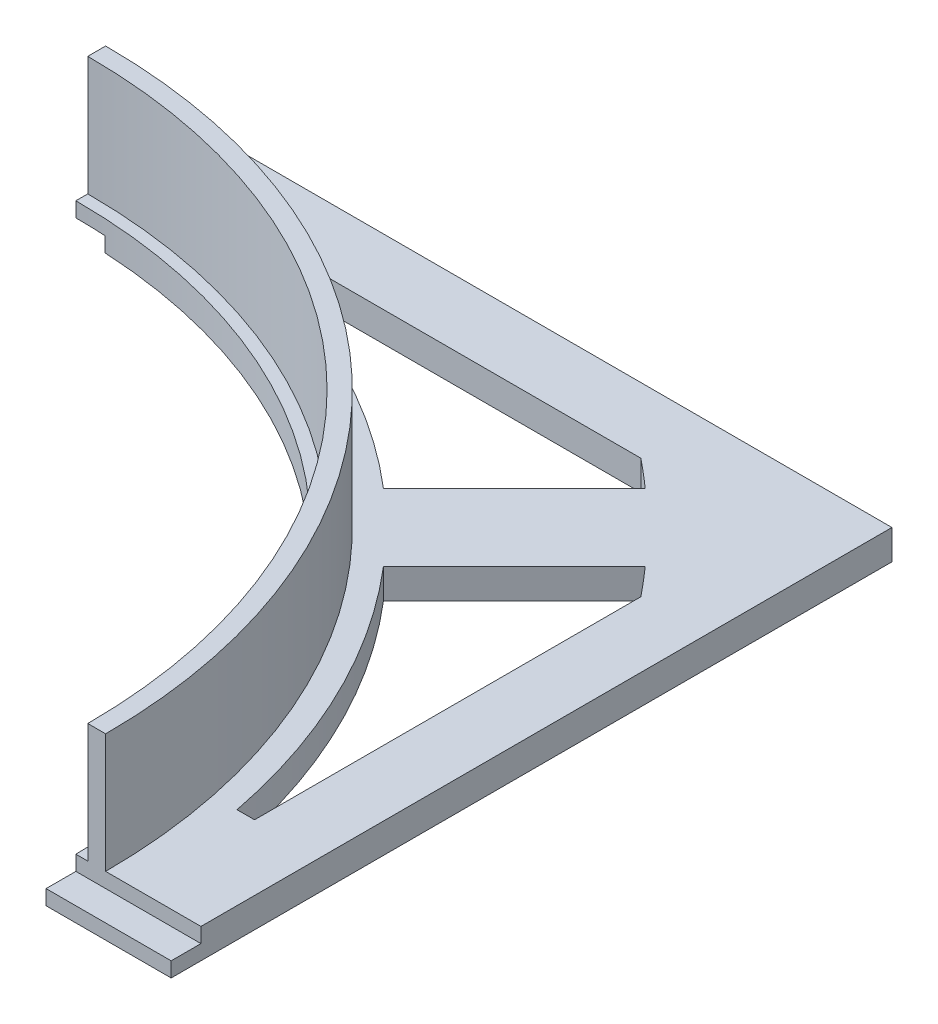
ISO-10303-21;
HEADER;
FILE_DESCRIPTION(('STEP AP214'),'2;1');
FILE_NAME('part.step','',(''),(''),'','','');
FILE_SCHEMA(('AUTOMOTIVE_DESIGN { 1 0 10303 214 1 1 1 1 }'));
ENDSEC;
DATA;
#1=APPLICATION_CONTEXT('core data for automotive mechanical design processes');
#2=APPLICATION_PROTOCOL_DEFINITION('international standard','automotive_design',2000,#1);
#3=PRODUCT_CONTEXT('',#1,'mechanical');
#4=PRODUCT('Part','Part','',(#3));
#5=PRODUCT_RELATED_PRODUCT_CATEGORY('part','',(#4));
#6=PRODUCT_DEFINITION_FORMATION('','',#4);
#7=PRODUCT_DEFINITION_CONTEXT('part definition',#1,'design');
#8=PRODUCT_DEFINITION('design','',#6,#7);
#9=PRODUCT_DEFINITION_SHAPE('','',#8);
#10=(LENGTH_UNIT() NAMED_UNIT(*) SI_UNIT(.MILLI.,.METRE.));
#11=(NAMED_UNIT(*) PLANE_ANGLE_UNIT() SI_UNIT($,.RADIAN.));
#12=(NAMED_UNIT(*) SI_UNIT($,.STERADIAN.) SOLID_ANGLE_UNIT());
#13=UNCERTAINTY_MEASURE_WITH_UNIT(LENGTH_MEASURE(1.E-05),#10,'distance_accuracy_value','');
#14=(GEOMETRIC_REPRESENTATION_CONTEXT(3) GLOBAL_UNCERTAINTY_ASSIGNED_CONTEXT((#13)) GLOBAL_UNIT_ASSIGNED_CONTEXT((#10,
#11,#12)) REPRESENTATION_CONTEXT('',''));
#15=CARTESIAN_POINT('',(0.,0.,0.));
#16=DIRECTION('',(0.,0.,1.));
#17=DIRECTION('',(1.,0.,0.));
#18=AXIS2_PLACEMENT_3D('',#15,#16,#17);
#19=CARTESIAN_POINT('',(116.,5.,0.));
#20=DIRECTION('',(0.,0.,-1.));
#21=DIRECTION('',(-1.,0.,0.));
#22=AXIS2_PLACEMENT_3D('',#19,#20,#21);
#23=PLANE('',#22);
#24=DIRECTION('',(-1.,0.,0.));
#25=VECTOR('',#24,1.);
#26=CARTESIAN_POINT('',(116.,2.5,0.));
#27=LINE('',#26,#25);
#28=CARTESIAN_POINT('',(116.,2.5,0.));
#29=VERTEX_POINT('',#28);
#30=CARTESIAN_POINT('',(95.,2.5,0.));
#31=VERTEX_POINT('',#30);
#32=EDGE_CURVE('E47',#29,#31,#27,.T.);
#33=ORIENTED_EDGE('',*,*,#32,.F.);
#34=DIRECTION('',(0.,-1.,0.));
#35=VECTOR('',#34,1.);
#36=CARTESIAN_POINT('',(116.,5.,0.));
#37=LINE('',#36,#35);
#38=CARTESIAN_POINT('',(116.,5.,0.));
#39=VERTEX_POINT('',#38);
#40=EDGE_CURVE('E40',#39,#29,#37,.T.);
#41=ORIENTED_EDGE('',*,*,#40,.F.);
#42=DIRECTION('',(1.,0.,0.));
#43=VECTOR('',#42,1.);
#44=CARTESIAN_POINT('',(116.,5.,0.));
#45=LINE('',#44,#43);
#46=CARTESIAN_POINT('',(100.,5.,0.));
#47=VERTEX_POINT('',#46);
#48=EDGE_CURVE('E355',#47,#39,#45,.T.);
#49=ORIENTED_EDGE('',*,*,#48,.F.);
#50=DIRECTION('',(0.,-1.,0.));
#51=VECTOR('',#50,1.);
#52=CARTESIAN_POINT('',(100.,25.,0.));
#53=LINE('',#52,#51);
#54=CARTESIAN_POINT('',(100.,25.,0.));
#55=VERTEX_POINT('',#54);
#56=EDGE_CURVE('E337',#55,#47,#53,.T.);
#57=ORIENTED_EDGE('',*,*,#56,.F.);
#58=DIRECTION('',(1.,0.,0.));
#59=VECTOR('',#58,1.);
#60=CARTESIAN_POINT('',(97.,25.,0.));
#61=LINE('',#60,#59);
#62=CARTESIAN_POINT('',(97.,25.,0.));
#63=VERTEX_POINT('',#62);
#64=EDGE_CURVE('E335',#63,#55,#61,.T.);
#65=ORIENTED_EDGE('',*,*,#64,.F.);
#66=DIRECTION('',(0.,-1.,0.));
#67=VECTOR('',#66,1.);
#68=CARTESIAN_POINT('',(97.,25.,0.));
#69=LINE('',#68,#67);
#70=CARTESIAN_POINT('',(97.,5.,0.));
#71=VERTEX_POINT('',#70);
#72=EDGE_CURVE('E344',#63,#71,#69,.T.);
#73=ORIENTED_EDGE('',*,*,#72,.T.);
#74=CARTESIAN_POINT('',(95.,5.,0.));
#75=VERTEX_POINT('',#74);
#76=EDGE_CURVE('E192',#75,#71,#45,.T.);
#77=ORIENTED_EDGE('',*,*,#76,.F.);
#78=DIRECTION('',(0.,-1.,0.));
#79=VECTOR('',#78,1.);
#80=CARTESIAN_POINT('',(95.,5.,0.));
#81=LINE('',#80,#79);
#82=EDGE_CURVE('E189',#75,#31,#81,.T.);
#83=ORIENTED_EDGE('',*,*,#82,.T.);
#84=EDGE_LOOP('',(#33,#41,#49,#57,#65,#73,#77,#83));
#85=FACE_BOUND('',#84,.T.);
#86=ADVANCED_FACE('F33',(#85),#23,.F.);
#87=CARTESIAN_POINT('',(0.,5.,-95.));
#88=DIRECTION('',(1.,0.,0.));
#89=DIRECTION('',(0.,0.,-1.));
#90=AXIS2_PLACEMENT_3D('',#87,#88,#89);
#91=PLANE('',#90);
#92=DIRECTION('',(0.,0.,-1.));
#93=VECTOR('',#92,1.);
#94=CARTESIAN_POINT('',(0.,2.5,-95.));
#95=LINE('',#94,#93);
#96=CARTESIAN_POINT('',(0.,2.5,-95.));
#97=VERTEX_POINT('',#96);
#98=CARTESIAN_POINT('',(0.,2.5,-116.));
#99=VERTEX_POINT('',#98);
#100=EDGE_CURVE('E236',#97,#99,#95,.T.);
#101=ORIENTED_EDGE('',*,*,#100,.F.);
#102=DIRECTION('',(0.,-1.,0.));
#103=VECTOR('',#102,1.);
#104=CARTESIAN_POINT('',(0.,5.,-95.));
#105=LINE('',#104,#103);
#106=CARTESIAN_POINT('',(0.,5.,-95.));
#107=VERTEX_POINT('',#106);
#108=EDGE_CURVE('E195',#107,#97,#105,.T.);
#109=ORIENTED_EDGE('',*,*,#108,.F.);
#110=DIRECTION('',(0.,0.,1.));
#111=VECTOR('',#110,1.);
#112=CARTESIAN_POINT('',(0.,5.,-95.));
#113=LINE('',#112,#111);
#114=CARTESIAN_POINT('',(0.,5.,-97.));
#115=VERTEX_POINT('',#114);
#116=EDGE_CURVE('E359',#115,#107,#113,.T.);
#117=ORIENTED_EDGE('',*,*,#116,.F.);
#118=DIRECTION('',(0.,-1.,0.));
#119=VECTOR('',#118,1.);
#120=CARTESIAN_POINT('',(0.,25.,-97.));
#121=LINE('',#120,#119);
#122=CARTESIAN_POINT('',(0.,25.,-97.));
#123=VERTEX_POINT('',#122);
#124=EDGE_CURVE('E346',#123,#115,#121,.T.);
#125=ORIENTED_EDGE('',*,*,#124,.F.);
#126=DIRECTION('',(0.,0.,1.));
#127=VECTOR('',#126,1.);
#128=CARTESIAN_POINT('',(0.,25.,-100.));
#129=LINE('',#128,#127);
#130=CARTESIAN_POINT('',(0.,25.,-100.));
#131=VERTEX_POINT('',#130);
#132=EDGE_CURVE('E330',#131,#123,#129,.T.);
#133=ORIENTED_EDGE('',*,*,#132,.F.);
#134=DIRECTION('',(0.,-1.,0.));
#135=VECTOR('',#134,1.);
#136=CARTESIAN_POINT('',(0.,25.,-100.));
#137=LINE('',#136,#135);
#138=CARTESIAN_POINT('',(0.,5.,-100.));
#139=VERTEX_POINT('',#138);
#140=EDGE_CURVE('E349',#131,#139,#137,.T.);
#141=ORIENTED_EDGE('',*,*,#140,.T.);
#142=CARTESIAN_POINT('',(0.,5.,-116.));
#143=VERTEX_POINT('',#142);
#144=EDGE_CURVE('E360',#143,#139,#113,.T.);
#145=ORIENTED_EDGE('',*,*,#144,.F.);
#146=DIRECTION('',(0.,-1.,0.));
#147=VECTOR('',#146,1.);
#148=CARTESIAN_POINT('',(0.,5.,-116.));
#149=LINE('',#148,#147);
#150=EDGE_CURVE('E370',#143,#99,#149,.T.);
#151=ORIENTED_EDGE('',*,*,#150,.T.);
#152=EDGE_LOOP('',(#101,#109,#117,#125,#133,#141,#145,#151));
#153=FACE_BOUND('',#152,.T.);
#154=ADVANCED_FACE('F400',(#153),#91,.F.);
#155=CARTESIAN_POINT('',(0.,5.,0.));
#156=DIRECTION('',(0.,1.,0.));
#157=DIRECTION('',(0.,0.,1.));
#158=AXIS2_PLACEMENT_3D('',#155,#156,#157);
#159=PLANE('',#158);
#160=DIRECTION('',(0.,0.,1.));
#161=VECTOR('',#160,1.);
#162=CARTESIAN_POINT('',(20.,5.,-105.));
#163=LINE('',#162,#161);
#164=CARTESIAN_POINT('',(20.,5.,-105.));
#165=VERTEX_POINT('',#164);
#166=CARTESIAN_POINT('',(20.,5.,-102.058806577385));
#167=VERTEX_POINT('',#166);
#168=EDGE_CURVE('E278',#165,#167,#163,.T.);
#169=ORIENTED_EDGE('',*,*,#168,.F.);
#170=DIRECTION('',(-1.,0.,0.));
#171=VECTOR('',#170,1.);
#172=CARTESIAN_POINT('',(20.,5.,-105.));
#173=LINE('',#172,#171);
#174=CARTESIAN_POINT('',(84.8528137423857,5.,-105.));
#175=VERTEX_POINT('',#174);
#176=EDGE_CURVE('E291',#175,#165,#173,.T.);
#177=ORIENTED_EDGE('',*,*,#176,.F.);
#178=CARTESIAN_POINT('',(0.,5.,0.));
#179=DIRECTION('',(0.,1.,0.));
#180=DIRECTION('',(0.,0.,1.));
#181=AXIS2_PLACEMENT_3D('',#178,#179,#180);
#182=CIRCLE('',#181,135.);
#183=CARTESIAN_POINT('',(89.6348033077146,5.,-100.948511806699));
#184=VERTEX_POINT('',#183);
#185=EDGE_CURVE('E311',#184,#175,#182,.T.);
#186=ORIENTED_EDGE('',*,*,#185,.F.);
#187=DIRECTION('',(0.707106781186547,0.,-0.707106781186548));
#188=VECTOR('',#187,1.);
#189=CARTESIAN_POINT('',(67.6643568698011,5.,-78.9780653687858));
#190=LINE('',#189,#188);
#191=CARTESIAN_POINT('',(67.6643568698011,5.,-78.9780653687858));
#192=VERTEX_POINT('',#191);
#193=EDGE_CURVE('E308',#192,#184,#190,.T.);
#194=ORIENTED_EDGE('',*,*,#193,.F.);
#195=CARTESIAN_POINT('',(0.,5.,0.));
#196=DIRECTION('',(0.,-1.,0.));
#197=DIRECTION('',(0.,0.,1.));
#198=AXIS2_PLACEMENT_3D('',#195,#196,#197);
#199=CIRCLE('',#198,104.);
#200=EDGE_CURVE('E305',#167,#192,#199,.T.);
#201=ORIENTED_EDGE('',*,*,#200,.F.);
#202=EDGE_LOOP('',(#169,#177,#186,#194,#201));
#203=FACE_BOUND('',#202,.T.);
#204=CARTESIAN_POINT('',(0.,5.,0.));
#205=DIRECTION('',(0.,1.,0.));
#206=DIRECTION('',(0.,0.,1.));
#207=AXIS2_PLACEMENT_3D('',#204,#205,#206);
#208=CIRCLE('',#207,100.);
#209=EDGE_CURVE('E318',#47,#139,#208,.T.);
#210=ORIENTED_EDGE('',*,*,#209,.F.);
#211=ORIENTED_EDGE('',*,*,#48,.T.);
#212=DIRECTION('',(0.,0.,-1.));
#213=VECTOR('',#212,1.);
#214=CARTESIAN_POINT('',(116.,5.,-116.));
#215=LINE('',#214,#213);
#216=CARTESIAN_POINT('',(116.,5.,-116.));
#217=VERTEX_POINT('',#216);
#218=EDGE_CURVE('E354',#39,#217,#215,.T.);
#219=ORIENTED_EDGE('',*,*,#218,.T.);
#220=DIRECTION('',(-1.,0.,0.));
#221=VECTOR('',#220,1.);
#222=CARTESIAN_POINT('',(0.,5.,-116.));
#223=LINE('',#222,#221);
#224=EDGE_CURVE('E357',#217,#143,#223,.T.);
#225=ORIENTED_EDGE('',*,*,#224,.T.);
#226=ORIENTED_EDGE('',*,*,#144,.T.);
#227=EDGE_LOOP('',(#210,#211,#219,#225,#226));
#228=FACE_BOUND('',#227,.T.);
#229=CARTESIAN_POINT('',(0.,5.,0.));
#230=DIRECTION('',(0.,-1.,0.));
#231=DIRECTION('',(0.,0.,1.));
#232=AXIS2_PLACEMENT_3D('',#229,#230,#231);
#233=CIRCLE('',#232,104.);
#234=CARTESIAN_POINT('',(78.9780653687858,5.,-67.6643568698011));
#235=VERTEX_POINT('',#234);
#236=CARTESIAN_POINT('',(102.058806577385,5.,-20.));
#237=VERTEX_POINT('',#236);
#238=EDGE_CURVE('E245',#235,#237,#233,.T.);
#239=ORIENTED_EDGE('',*,*,#238,.F.);
#240=DIRECTION('',(-0.707106781186548,0.,0.707106781186547));
#241=VECTOR('',#240,1.);
#242=CARTESIAN_POINT('',(78.9780653687858,5.,-67.6643568698011));
#243=LINE('',#242,#241);
#244=CARTESIAN_POINT('',(100.948511806699,5.,-89.6348033077146));
#245=VERTEX_POINT('',#244);
#246=EDGE_CURVE('E251',#245,#235,#243,.T.);
#247=ORIENTED_EDGE('',*,*,#246,.F.);
#248=CARTESIAN_POINT('',(0.,5.,0.));
#249=DIRECTION('',(0.,1.,0.));
#250=DIRECTION('',(0.,0.,1.));
#251=AXIS2_PLACEMENT_3D('',#248,#249,#250);
#252=CIRCLE('',#251,135.);
#253=CARTESIAN_POINT('',(105.,5.,-84.8528137423857));
#254=VERTEX_POINT('',#253);
#255=EDGE_CURVE('E271',#254,#245,#252,.T.);
#256=ORIENTED_EDGE('',*,*,#255,.F.);
#257=DIRECTION('',(0.,0.,-1.));
#258=VECTOR('',#257,1.);
#259=CARTESIAN_POINT('',(105.,5.,-84.8528137423857));
#260=LINE('',#259,#258);
#261=CARTESIAN_POINT('',(105.,5.,-20.));
#262=VERTEX_POINT('',#261);
#263=EDGE_CURVE('E268',#262,#254,#260,.T.);
#264=ORIENTED_EDGE('',*,*,#263,.F.);
#265=DIRECTION('',(1.,0.,0.));
#266=VECTOR('',#265,1.);
#267=CARTESIAN_POINT('',(105.,5.,-20.));
#268=LINE('',#267,#266);
#269=EDGE_CURVE('E265',#237,#262,#268,.T.);
#270=ORIENTED_EDGE('',*,*,#269,.F.);
#271=EDGE_LOOP('',(#239,#247,#256,#264,#270));
#272=FACE_BOUND('',#271,.T.);
#273=ADVANCED_FACE('F409',(#203,#228,#272),#159,.T.);
#274=CARTESIAN_POINT('',(0.,0.,0.));
#275=DIRECTION('',(0.,1.,0.));
#276=DIRECTION('',(0.,0.,1.));
#277=AXIS2_PLACEMENT_3D('',#274,#275,#276);
#278=PLANE('',#277);
#279=CARTESIAN_POINT('',(0.,0.,0.));
#280=DIRECTION('',(0.,-1.,0.));
#281=DIRECTION('',(0.,0.,1.));
#282=AXIS2_PLACEMENT_3D('',#279,#280,#281);
#283=CIRCLE('',#282,95.);
#284=CARTESIAN_POINT('',(5.,0.,-94.8683298050514));
#285=VERTEX_POINT('',#284);
#286=CARTESIAN_POINT('',(95.,0.,0.));
#287=VERTEX_POINT('',#286);
#288=EDGE_CURVE('E205',#285,#287,#283,.T.);
#289=ORIENTED_EDGE('',*,*,#288,.F.);
#290=DIRECTION('',(0.,0.,1.));
#291=VECTOR('',#290,1.);
#292=CARTESIAN_POINT('',(5.,0.,-116.));
#293=LINE('',#292,#291);
#294=CARTESIAN_POINT('',(5.,0.,-116.));
#295=VERTEX_POINT('',#294);
#296=EDGE_CURVE('E208',#295,#285,#293,.T.);
#297=ORIENTED_EDGE('',*,*,#296,.F.);
#298=DIRECTION('',(-1.,0.,0.));
#299=VECTOR('',#298,1.);
#300=CARTESIAN_POINT('',(0.,0.,-116.));
#301=LINE('',#300,#299);
#302=CARTESIAN_POINT('',(116.,0.,-116.));
#303=VERTEX_POINT('',#302);
#304=EDGE_CURVE('E364',#303,#295,#301,.T.);
#305=ORIENTED_EDGE('',*,*,#304,.F.);
#306=DIRECTION('',(0.,0.,-1.));
#307=VECTOR('',#306,1.);
#308=CARTESIAN_POINT('',(116.,0.,-116.));
#309=LINE('',#308,#307);
#310=CARTESIAN_POINT('',(116.,0.,5.));
#311=VERTEX_POINT('',#310);
#312=EDGE_CURVE('E352',#311,#303,#309,.T.);
#313=ORIENTED_EDGE('',*,*,#312,.F.);
#314=DIRECTION('',(1.,0.,0.));
#315=VECTOR('',#314,1.);
#316=CARTESIAN_POINT('',(95.,0.,5.));
#317=LINE('',#316,#315);
#318=CARTESIAN_POINT('',(95.,0.,5.));
#319=VERTEX_POINT('',#318);
#320=EDGE_CURVE('E223',#319,#311,#317,.T.);
#321=ORIENTED_EDGE('',*,*,#320,.F.);
#322=DIRECTION('',(0.,0.,1.));
#323=VECTOR('',#322,1.);
#324=CARTESIAN_POINT('',(95.,0.,0.));
#325=LINE('',#324,#323);
#326=EDGE_CURVE('E226',#287,#319,#325,.T.);
#327=ORIENTED_EDGE('',*,*,#326,.F.);
#328=EDGE_LOOP('',(#289,#297,#305,#313,#321,#327));
#329=FACE_BOUND('',#328,.T.);
#330=DIRECTION('',(-1.,0.,0.));
#331=VECTOR('',#330,1.);
#332=CARTESIAN_POINT('',(20.,0.,-105.));
#333=LINE('',#332,#331);
#334=CARTESIAN_POINT('',(84.8528137423857,0.,-105.));
#335=VERTEX_POINT('',#334);
#336=CARTESIAN_POINT('',(20.,0.,-105.));
#337=VERTEX_POINT('',#336);
#338=EDGE_CURVE('E300',#335,#337,#333,.T.);
#339=ORIENTED_EDGE('',*,*,#338,.T.);
#340=DIRECTION('',(0.,0.,1.));
#341=VECTOR('',#340,1.);
#342=CARTESIAN_POINT('',(20.,0.,-105.));
#343=LINE('',#342,#341);
#344=CARTESIAN_POINT('',(20.,0.,-102.058806577385));
#345=VERTEX_POINT('',#344);
#346=EDGE_CURVE('E287',#337,#345,#343,.T.);
#347=ORIENTED_EDGE('',*,*,#346,.T.);
#348=CARTESIAN_POINT('',(0.,0.,0.));
#349=DIRECTION('',(0.,-1.,0.));
#350=DIRECTION('',(0.,0.,1.));
#351=AXIS2_PLACEMENT_3D('',#348,#349,#350);
#352=CIRCLE('',#351,104.);
#353=CARTESIAN_POINT('',(67.6643568698011,0.,-78.9780653687858));
#354=VERTEX_POINT('',#353);
#355=EDGE_CURVE('E290',#345,#354,#352,.T.);
#356=ORIENTED_EDGE('',*,*,#355,.T.);
#357=DIRECTION('',(0.707106781186547,0.,-0.707106781186548));
#358=VECTOR('',#357,1.);
#359=CARTESIAN_POINT('',(67.6643568698011,0.,-78.9780653687858));
#360=LINE('',#359,#358);
#361=CARTESIAN_POINT('',(89.6348033077146,0.,-100.948511806699));
#362=VERTEX_POINT('',#361);
#363=EDGE_CURVE('E294',#354,#362,#360,.T.);
#364=ORIENTED_EDGE('',*,*,#363,.T.);
#365=CARTESIAN_POINT('',(0.,0.,0.));
#366=DIRECTION('',(0.,1.,0.));
#367=DIRECTION('',(0.,0.,1.));
#368=AXIS2_PLACEMENT_3D('',#365,#366,#367);
#369=CIRCLE('',#368,135.);
#370=EDGE_CURVE('E297',#362,#335,#369,.T.);
#371=ORIENTED_EDGE('',*,*,#370,.T.);
#372=EDGE_LOOP('',(#339,#347,#356,#364,#371));
#373=FACE_BOUND('',#372,.T.);
#374=DIRECTION('',(-0.707106781186548,0.,0.707106781186547));
#375=VECTOR('',#374,1.);
#376=CARTESIAN_POINT('',(78.9780653687858,0.,-67.6643568698011));
#377=LINE('',#376,#375);
#378=CARTESIAN_POINT('',(100.948511806699,0.,-89.6348033077146));
#379=VERTEX_POINT('',#378);
#380=CARTESIAN_POINT('',(78.9780653687858,0.,-67.6643568698011));
#381=VERTEX_POINT('',#380);
#382=EDGE_CURVE('E260',#379,#381,#377,.T.);
#383=ORIENTED_EDGE('',*,*,#382,.T.);
#384=CARTESIAN_POINT('',(0.,0.,0.));
#385=DIRECTION('',(0.,-1.,0.));
#386=DIRECTION('',(0.,0.,1.));
#387=AXIS2_PLACEMENT_3D('',#384,#385,#386);
#388=CIRCLE('',#387,104.);
#389=CARTESIAN_POINT('',(102.058806577385,0.,-20.));
#390=VERTEX_POINT('',#389);
#391=EDGE_CURVE('E247',#381,#390,#388,.T.);
#392=ORIENTED_EDGE('',*,*,#391,.T.);
#393=DIRECTION('',(1.,0.,0.));
#394=VECTOR('',#393,1.);
#395=CARTESIAN_POINT('',(105.,0.,-20.));
#396=LINE('',#395,#394);
#397=CARTESIAN_POINT('',(105.,0.,-20.));
#398=VERTEX_POINT('',#397);
#399=EDGE_CURVE('E250',#390,#398,#396,.T.);
#400=ORIENTED_EDGE('',*,*,#399,.T.);
#401=DIRECTION('',(0.,0.,-1.));
#402=VECTOR('',#401,1.);
#403=CARTESIAN_POINT('',(105.,0.,-84.8528137423857));
#404=LINE('',#403,#402);
#405=CARTESIAN_POINT('',(105.,0.,-84.8528137423857));
#406=VERTEX_POINT('',#405);
#407=EDGE_CURVE('E254',#398,#406,#404,.T.);
#408=ORIENTED_EDGE('',*,*,#407,.T.);
#409=CARTESIAN_POINT('',(0.,0.,0.));
#410=DIRECTION('',(0.,1.,0.));
#411=DIRECTION('',(0.,0.,1.));
#412=AXIS2_PLACEMENT_3D('',#409,#410,#411);
#413=CIRCLE('',#412,135.);
#414=EDGE_CURVE('E257',#406,#379,#413,.T.);
#415=ORIENTED_EDGE('',*,*,#414,.T.);
#416=EDGE_LOOP('',(#383,#392,#400,#408,#415));
#417=FACE_BOUND('',#416,.T.);
#418=ADVANCED_FACE('F414',(#329,#373,#417),#278,.F.);
#419=CARTESIAN_POINT('',(0.,5.,0.));
#420=DIRECTION('',(0.,-1.,0.));
#421=DIRECTION('',(0.,0.,1.));
#422=AXIS2_PLACEMENT_3D('',#419,#420,#421);
#423=CIRCLE('',#422,97.);
#424=EDGE_CURVE('E331',#115,#71,#423,.T.);
#425=ORIENTED_EDGE('',*,*,#424,.F.);
#426=ORIENTED_EDGE('',*,*,#116,.T.);
#427=CARTESIAN_POINT('',(0.,5.,0.));
#428=DIRECTION('',(0.,-1.,0.));
#429=DIRECTION('',(0.,0.,1.));
#430=AXIS2_PLACEMENT_3D('',#427,#428,#429);
#431=CIRCLE('',#430,95.);
#432=EDGE_CURVE('E196',#107,#75,#431,.T.);
#433=ORIENTED_EDGE('',*,*,#432,.T.);
#434=ORIENTED_EDGE('',*,*,#76,.T.);
#435=EDGE_LOOP('',(#425,#426,#433,#434));
#436=FACE_BOUND('',#435,.T.);
#437=ADVANCED_FACE('F396',(#436),#159,.T.);
#438=CARTESIAN_POINT('',(116.,5.,-116.));
#439=DIRECTION('',(-1.,0.,0.));
#440=DIRECTION('',(0.,0.,1.));
#441=AXIS2_PLACEMENT_3D('',#438,#439,#440);
#442=PLANE('',#441);
#443=ORIENTED_EDGE('',*,*,#312,.T.);
#444=DIRECTION('',(0.,-1.,0.));
#445=VECTOR('',#444,1.);
#446=CARTESIAN_POINT('',(116.,5.,-116.));
#447=LINE('',#446,#445);
#448=EDGE_CURVE('E373',#217,#303,#447,.T.);
#449=ORIENTED_EDGE('',*,*,#448,.F.);
#450=ORIENTED_EDGE('',*,*,#218,.F.);
#451=ORIENTED_EDGE('',*,*,#40,.T.);
#452=DIRECTION('',(0.,0.,-1.));
#453=VECTOR('',#452,1.);
#454=CARTESIAN_POINT('',(116.,2.5,5.));
#455=LINE('',#454,#453);
#456=CARTESIAN_POINT('',(116.,2.5,5.));
#457=VERTEX_POINT('',#456);
#458=EDGE_CURVE('E222',#457,#29,#455,.T.);
#459=ORIENTED_EDGE('',*,*,#458,.F.);
#460=DIRECTION('',(0.,-1.,0.));
#461=VECTOR('',#460,1.);
#462=CARTESIAN_POINT('',(116.,2.5,5.));
#463=LINE('',#462,#461);
#464=EDGE_CURVE('E231',#457,#311,#463,.T.);
#465=ORIENTED_EDGE('',*,*,#464,.T.);
#466=EDGE_LOOP('',(#443,#449,#450,#451,#459,#465));
#467=FACE_BOUND('',#466,.T.);
#468=ADVANCED_FACE('F377',(#467),#442,.F.);
#469=CARTESIAN_POINT('',(0.,5.,-116.));
#470=DIRECTION('',(0.,0.,1.));
#471=DIRECTION('',(1.,0.,0.));
#472=AXIS2_PLACEMENT_3D('',#469,#470,#471);
#473=PLANE('',#472);
#474=ORIENTED_EDGE('',*,*,#304,.T.);
#475=DIRECTION('',(0.,-1.,0.));
#476=VECTOR('',#475,1.);
#477=CARTESIAN_POINT('',(5.,2.5,-116.));
#478=LINE('',#477,#476);
#479=CARTESIAN_POINT('',(5.,2.5,-116.));
#480=VERTEX_POINT('',#479);
#481=EDGE_CURVE('E241',#480,#295,#478,.T.);
#482=ORIENTED_EDGE('',*,*,#481,.F.);
#483=DIRECTION('',(1.,0.,0.));
#484=VECTOR('',#483,1.);
#485=CARTESIAN_POINT('',(0.,2.5,-116.));
#486=LINE('',#485,#484);
#487=EDGE_CURVE('E238',#99,#480,#486,.T.);
#488=ORIENTED_EDGE('',*,*,#487,.F.);
#489=ORIENTED_EDGE('',*,*,#150,.F.);
#490=ORIENTED_EDGE('',*,*,#224,.F.);
#491=ORIENTED_EDGE('',*,*,#448,.T.);
#492=EDGE_LOOP('',(#474,#482,#488,#489,#490,#491));
#493=FACE_BOUND('',#492,.T.);
#494=ADVANCED_FACE('F406',(#493),#473,.F.);
#495=CARTESIAN_POINT('',(0.,5.,0.));
#496=DIRECTION('',(0.,-1.,0.));
#497=DIRECTION('',(0.,0.,-1.));
#498=AXIS2_PLACEMENT_3D('',#495,#496,#497);
#499=CYLINDRICAL_SURFACE('',#498,95.);
#500=CARTESIAN_POINT('',(0.,2.5,0.));
#501=DIRECTION('',(0.,-1.,0.));
#502=DIRECTION('',(0.,0.,-1.));
#503=AXIS2_PLACEMENT_3D('',#500,#501,#502);
#504=CIRCLE('',#503,95.);
#505=CARTESIAN_POINT('',(5.,2.5,-94.8683298050514));
#506=VERTEX_POINT('',#505);
#507=EDGE_CURVE('E11',#506,#97,#504,.F.);
#508=ORIENTED_EDGE('',*,*,#507,.F.);
#509=DIRECTION('',(0.,-1.,0.));
#510=VECTOR('',#509,1.);
#511=CARTESIAN_POINT('',(5.,2.5,-94.8683298050514));
#512=LINE('',#511,#510);
#513=EDGE_CURVE('E243',#506,#285,#512,.T.);
#514=ORIENTED_EDGE('',*,*,#513,.T.);
#515=ORIENTED_EDGE('',*,*,#288,.T.);
#516=DIRECTION('',(0.,-1.,0.));
#517=VECTOR('',#516,1.);
#518=CARTESIAN_POINT('',(95.,2.5,0.));
#519=LINE('',#518,#517);
#520=EDGE_CURVE('E199',#31,#287,#519,.T.);
#521=ORIENTED_EDGE('',*,*,#520,.F.);
#522=ORIENTED_EDGE('',*,*,#82,.F.);
#523=ORIENTED_EDGE('',*,*,#432,.F.);
#524=ORIENTED_EDGE('',*,*,#108,.T.);
#525=EDGE_LOOP('',(#508,#514,#515,#521,#522,#523,#524));
#526=FACE_BOUND('',#525,.T.);
#527=ADVANCED_FACE('F202',(#526),#499,.F.);
#528=CARTESIAN_POINT('',(0.,25.,0.));
#529=DIRECTION('',(0.,-1.,0.));
#530=DIRECTION('',(0.,0.,-1.));
#531=AXIS2_PLACEMENT_3D('',#528,#529,#530);
#532=CYLINDRICAL_SURFACE('',#531,100.);
#533=ORIENTED_EDGE('',*,*,#209,.T.);
#534=ORIENTED_EDGE('',*,*,#140,.F.);
#535=CARTESIAN_POINT('',(0.,25.,0.));
#536=DIRECTION('',(0.,1.,0.));
#537=DIRECTION('',(0.,0.,1.));
#538=AXIS2_PLACEMENT_3D('',#535,#536,#537);
#539=CIRCLE('',#538,100.);
#540=EDGE_CURVE('E327',#55,#131,#539,.T.);
#541=ORIENTED_EDGE('',*,*,#540,.F.);
#542=ORIENTED_EDGE('',*,*,#56,.T.);
#543=EDGE_LOOP('',(#533,#534,#541,#542));
#544=FACE_BOUND('',#543,.T.);
#545=ADVANCED_FACE('F385',(#544),#532,.T.);
#546=CARTESIAN_POINT('',(0.,25.,0.));
#547=DIRECTION('',(0.,-1.,0.));
#548=DIRECTION('',(0.,0.,-1.));
#549=AXIS2_PLACEMENT_3D('',#546,#547,#548);
#550=CYLINDRICAL_SURFACE('',#549,97.);
#551=ORIENTED_EDGE('',*,*,#424,.T.);
#552=ORIENTED_EDGE('',*,*,#72,.F.);
#553=CARTESIAN_POINT('',(0.,25.,0.));
#554=DIRECTION('',(0.,-1.,0.));
#555=DIRECTION('',(0.,0.,1.));
#556=AXIS2_PLACEMENT_3D('',#553,#554,#555);
#557=CIRCLE('',#556,97.);
#558=EDGE_CURVE('E333',#123,#63,#557,.T.);
#559=ORIENTED_EDGE('',*,*,#558,.F.);
#560=ORIENTED_EDGE('',*,*,#124,.T.);
#561=EDGE_LOOP('',(#551,#552,#559,#560));
#562=FACE_BOUND('',#561,.T.);
#563=ADVANCED_FACE('F393',(#562),#550,.F.);
#564=CARTESIAN_POINT('',(0.,25.,0.));
#565=DIRECTION('',(0.,1.,0.));
#566=DIRECTION('',(0.,0.,1.));
#567=AXIS2_PLACEMENT_3D('',#564,#565,#566);
#568=PLANE('',#567);
#569=ORIENTED_EDGE('',*,*,#540,.T.);
#570=ORIENTED_EDGE('',*,*,#132,.T.);
#571=ORIENTED_EDGE('',*,*,#558,.T.);
#572=ORIENTED_EDGE('',*,*,#64,.T.);
#573=EDGE_LOOP('',(#569,#570,#571,#572));
#574=FACE_BOUND('',#573,.T.);
#575=ADVANCED_FACE('F388',(#574),#568,.T.);
#576=CARTESIAN_POINT('',(20.,0.,-105.));
#577=DIRECTION('',(-1.,0.,0.));
#578=DIRECTION('',(0.,0.,1.));
#579=AXIS2_PLACEMENT_3D('',#576,#577,#578);
#580=PLANE('',#579);
#581=ORIENTED_EDGE('',*,*,#168,.T.);
#582=DIRECTION('',(0.,1.,0.));
#583=VECTOR('',#582,1.);
#584=CARTESIAN_POINT('',(20.,0.,-102.058806577385));
#585=LINE('',#584,#583);
#586=EDGE_CURVE('E303',#345,#167,#585,.T.);
#587=ORIENTED_EDGE('',*,*,#586,.F.);
#588=ORIENTED_EDGE('',*,*,#346,.F.);
#589=DIRECTION('',(0.,1.,0.));
#590=VECTOR('',#589,1.);
#591=CARTESIAN_POINT('',(20.,0.,-105.));
#592=LINE('',#591,#590);
#593=EDGE_CURVE('E316',#337,#165,#592,.T.);
#594=ORIENTED_EDGE('',*,*,#593,.T.);
#595=EDGE_LOOP('',(#581,#587,#588,#594));
#596=FACE_BOUND('',#595,.T.);
#597=ADVANCED_FACE('F458',(#596),#580,.F.);
#598=CARTESIAN_POINT('',(20.,0.,-105.));
#599=DIRECTION('',(0.,0.,-1.));
#600=DIRECTION('',(-1.,0.,0.));
#601=AXIS2_PLACEMENT_3D('',#598,#599,#600);
#602=PLANE('',#601);
#603=ORIENTED_EDGE('',*,*,#176,.T.);
#604=ORIENTED_EDGE('',*,*,#593,.F.);
#605=ORIENTED_EDGE('',*,*,#338,.F.);
#606=DIRECTION('',(0.,1.,0.));
#607=VECTOR('',#606,1.);
#608=CARTESIAN_POINT('',(84.8528137423857,0.,-105.));
#609=LINE('',#608,#607);
#610=EDGE_CURVE('E319',#335,#175,#609,.T.);
#611=ORIENTED_EDGE('',*,*,#610,.T.);
#612=EDGE_LOOP('',(#603,#604,#605,#611));
#613=FACE_BOUND('',#612,.T.);
#614=ADVANCED_FACE('F461',(#613),#602,.F.);
#615=CARTESIAN_POINT('',(0.,0.,0.));
#616=DIRECTION('',(0.,1.,0.));
#617=DIRECTION('',(0.,0.,1.));
#618=AXIS2_PLACEMENT_3D('',#615,#616,#617);
#619=CYLINDRICAL_SURFACE('',#618,135.);
#620=ORIENTED_EDGE('',*,*,#185,.T.);
#621=ORIENTED_EDGE('',*,*,#610,.F.);
#622=ORIENTED_EDGE('',*,*,#370,.F.);
#623=DIRECTION('',(0.,1.,0.));
#624=VECTOR('',#623,1.);
#625=CARTESIAN_POINT('',(89.6348033077146,0.,-100.948511806699));
#626=LINE('',#625,#624);
#627=EDGE_CURVE('E321',#362,#184,#626,.T.);
#628=ORIENTED_EDGE('',*,*,#627,.T.);
#629=EDGE_LOOP('',(#620,#621,#622,#628));
#630=FACE_BOUND('',#629,.T.);
#631=ADVANCED_FACE('F471',(#630),#619,.F.);
#632=CARTESIAN_POINT('',(67.6643568698011,0.,-78.9780653687858));
#633=DIRECTION('',(0.707106781186548,0.,0.707106781186547));
#634=DIRECTION('',(0.707106781186547,0.,-0.707106781186548));
#635=AXIS2_PLACEMENT_3D('',#632,#633,#634);
#636=PLANE('',#635);
#637=ORIENTED_EDGE('',*,*,#193,.T.);
#638=ORIENTED_EDGE('',*,*,#627,.F.);
#639=ORIENTED_EDGE('',*,*,#363,.F.);
#640=DIRECTION('',(0.,1.,0.));
#641=VECTOR('',#640,1.);
#642=CARTESIAN_POINT('',(67.6643568698011,0.,-78.9780653687858));
#643=LINE('',#642,#641);
#644=EDGE_CURVE('E323',#354,#192,#643,.T.);
#645=ORIENTED_EDGE('',*,*,#644,.T.);
#646=EDGE_LOOP('',(#637,#638,#639,#645));
#647=FACE_BOUND('',#646,.T.);
#648=ADVANCED_FACE('F467',(#647),#636,.F.);
#649=CARTESIAN_POINT('',(0.,0.,0.));
#650=DIRECTION('',(0.,1.,0.));
#651=DIRECTION('',(0.,0.,1.));
#652=AXIS2_PLACEMENT_3D('',#649,#650,#651);
#653=CYLINDRICAL_SURFACE('',#652,104.);
#654=ORIENTED_EDGE('',*,*,#200,.T.);
#655=ORIENTED_EDGE('',*,*,#644,.F.);
#656=ORIENTED_EDGE('',*,*,#355,.F.);
#657=ORIENTED_EDGE('',*,*,#586,.T.);
#658=EDGE_LOOP('',(#654,#655,#656,#657));
#659=FACE_BOUND('',#658,.T.);
#660=ADVANCED_FACE('F463',(#659),#653,.T.);
#661=CARTESIAN_POINT('',(0.,0.,0.));
#662=DIRECTION('',(0.,1.,0.));
#663=DIRECTION('',(0.,0.,1.));
#664=AXIS2_PLACEMENT_3D('',#661,#662,#663);
#665=CYLINDRICAL_SURFACE('',#664,104.);
#666=ORIENTED_EDGE('',*,*,#238,.T.);
#667=DIRECTION('',(0.,1.,0.));
#668=VECTOR('',#667,1.);
#669=CARTESIAN_POINT('',(102.058806577385,0.,-20.));
#670=LINE('',#669,#668);
#671=EDGE_CURVE('E263',#390,#237,#670,.T.);
#672=ORIENTED_EDGE('',*,*,#671,.F.);
#673=ORIENTED_EDGE('',*,*,#391,.F.);
#674=DIRECTION('',(0.,1.,0.));
#675=VECTOR('',#674,1.);
#676=CARTESIAN_POINT('',(78.9780653687858,0.,-67.6643568698011));
#677=LINE('',#676,#675);
#678=EDGE_CURVE('E276',#381,#235,#677,.T.);
#679=ORIENTED_EDGE('',*,*,#678,.T.);
#680=EDGE_LOOP('',(#666,#672,#673,#679));
#681=FACE_BOUND('',#680,.T.);
#682=ADVANCED_FACE('F466',(#681),#665,.T.);
#683=CARTESIAN_POINT('',(78.9780653687858,0.,-67.6643568698011));
#684=DIRECTION('',(-0.707106781186547,0.,-0.707106781186548));
#685=DIRECTION('',(-0.707106781186548,0.,0.707106781186547));
#686=AXIS2_PLACEMENT_3D('',#683,#684,#685);
#687=PLANE('',#686);
#688=ORIENTED_EDGE('',*,*,#246,.T.);
#689=ORIENTED_EDGE('',*,*,#678,.F.);
#690=ORIENTED_EDGE('',*,*,#382,.F.);
#691=DIRECTION('',(0.,1.,0.));
#692=VECTOR('',#691,1.);
#693=CARTESIAN_POINT('',(100.948511806699,0.,-89.6348033077146));
#694=LINE('',#693,#692);
#695=EDGE_CURVE('E279',#379,#245,#694,.T.);
#696=ORIENTED_EDGE('',*,*,#695,.T.);
#697=EDGE_LOOP('',(#688,#689,#690,#696));
#698=FACE_BOUND('',#697,.T.);
#699=ADVANCED_FACE('F481',(#698),#687,.F.);
#700=CARTESIAN_POINT('',(0.,0.,0.));
#701=DIRECTION('',(0.,1.,0.));
#702=DIRECTION('',(0.,0.,1.));
#703=AXIS2_PLACEMENT_3D('',#700,#701,#702);
#704=CYLINDRICAL_SURFACE('',#703,135.);
#705=ORIENTED_EDGE('',*,*,#255,.T.);
#706=ORIENTED_EDGE('',*,*,#695,.F.);
#707=ORIENTED_EDGE('',*,*,#414,.F.);
#708=DIRECTION('',(0.,1.,0.));
#709=VECTOR('',#708,1.);
#710=CARTESIAN_POINT('',(105.,0.,-84.8528137423857));
#711=LINE('',#710,#709);
#712=EDGE_CURVE('E281',#406,#254,#711,.T.);
#713=ORIENTED_EDGE('',*,*,#712,.T.);
#714=EDGE_LOOP('',(#705,#706,#707,#713));
#715=FACE_BOUND('',#714,.T.);
#716=ADVANCED_FACE('F489',(#715),#704,.F.);
#717=CARTESIAN_POINT('',(105.,0.,-84.8528137423857));
#718=DIRECTION('',(1.,0.,0.));
#719=DIRECTION('',(0.,0.,-1.));
#720=AXIS2_PLACEMENT_3D('',#717,#718,#719);
#721=PLANE('',#720);
#722=ORIENTED_EDGE('',*,*,#263,.T.);
#723=ORIENTED_EDGE('',*,*,#712,.F.);
#724=ORIENTED_EDGE('',*,*,#407,.F.);
#725=DIRECTION('',(0.,1.,0.));
#726=VECTOR('',#725,1.);
#727=CARTESIAN_POINT('',(105.,0.,-20.));
#728=LINE('',#727,#726);
#729=EDGE_CURVE('E283',#398,#262,#728,.T.);
#730=ORIENTED_EDGE('',*,*,#729,.T.);
#731=EDGE_LOOP('',(#722,#723,#724,#730));
#732=FACE_BOUND('',#731,.T.);
#733=ADVANCED_FACE('F485',(#732),#721,.F.);
#734=CARTESIAN_POINT('',(105.,0.,-20.));
#735=DIRECTION('',(0.,0.,1.));
#736=DIRECTION('',(1.,0.,0.));
#737=AXIS2_PLACEMENT_3D('',#734,#735,#736);
#738=PLANE('',#737);
#739=ORIENTED_EDGE('',*,*,#269,.T.);
#740=ORIENTED_EDGE('',*,*,#729,.F.);
#741=ORIENTED_EDGE('',*,*,#399,.F.);
#742=ORIENTED_EDGE('',*,*,#671,.T.);
#743=EDGE_LOOP('',(#739,#740,#741,#742));
#744=FACE_BOUND('',#743,.T.);
#745=ADVANCED_FACE('F427',(#744),#738,.F.);
#746=CARTESIAN_POINT('',(0.,2.5,0.));
#747=DIRECTION('',(0.,-1.,0.));
#748=DIRECTION('',(0.,0.,-1.));
#749=AXIS2_PLACEMENT_3D('',#746,#747,#748);
#750=PLANE('',#749);
#751=ORIENTED_EDGE('',*,*,#507,.T.);
#752=ORIENTED_EDGE('',*,*,#100,.T.);
#753=ORIENTED_EDGE('',*,*,#487,.T.);
#754=DIRECTION('',(0.,0.,1.));
#755=VECTOR('',#754,1.);
#756=CARTESIAN_POINT('',(5.,2.5,-116.));
#757=LINE('',#756,#755);
#758=EDGE_CURVE('E54',#480,#506,#757,.T.);
#759=ORIENTED_EDGE('',*,*,#758,.T.);
#760=EDGE_LOOP('',(#751,#752,#753,#759));
#761=FACE_BOUND('',#760,.T.);
#762=ADVANCED_FACE('F401',(#761),#750,.T.);
#763=CARTESIAN_POINT('',(5.,2.5,-116.));
#764=DIRECTION('',(1.,0.,0.));
#765=DIRECTION('',(0.,0.,-1.));
#766=AXIS2_PLACEMENT_3D('',#763,#764,#765);
#767=PLANE('',#766);
#768=ORIENTED_EDGE('',*,*,#296,.T.);
#769=ORIENTED_EDGE('',*,*,#513,.F.);
#770=ORIENTED_EDGE('',*,*,#758,.F.);
#771=ORIENTED_EDGE('',*,*,#481,.T.);
#772=EDGE_LOOP('',(#768,#769,#770,#771));
#773=FACE_BOUND('',#772,.T.);
#774=ADVANCED_FACE('F418',(#773),#767,.F.);
#775=CARTESIAN_POINT('',(95.,2.5,0.));
#776=DIRECTION('',(1.,0.,0.));
#777=DIRECTION('',(0.,0.,-1.));
#778=AXIS2_PLACEMENT_3D('',#775,#776,#777);
#779=PLANE('',#778);
#780=ORIENTED_EDGE('',*,*,#326,.T.);
#781=DIRECTION('',(0.,-1.,0.));
#782=VECTOR('',#781,1.);
#783=CARTESIAN_POINT('',(95.,2.5,5.));
#784=LINE('',#783,#782);
#785=CARTESIAN_POINT('',(95.,2.5,5.));
#786=VERTEX_POINT('',#785);
#787=EDGE_CURVE('E209',#786,#319,#784,.T.);
#788=ORIENTED_EDGE('',*,*,#787,.F.);
#789=DIRECTION('',(0.,0.,1.));
#790=VECTOR('',#789,1.);
#791=CARTESIAN_POINT('',(95.,2.5,0.));
#792=LINE('',#791,#790);
#793=EDGE_CURVE('E212',#31,#786,#792,.T.);
#794=ORIENTED_EDGE('',*,*,#793,.F.);
#795=ORIENTED_EDGE('',*,*,#520,.T.);
#796=EDGE_LOOP('',(#780,#788,#794,#795));
#797=FACE_BOUND('',#796,.T.);
#798=ADVANCED_FACE('F213',(#797),#779,.F.);
#799=CARTESIAN_POINT('',(95.,2.5,5.));
#800=DIRECTION('',(0.,0.,-1.));
#801=DIRECTION('',(-1.,0.,0.));
#802=AXIS2_PLACEMENT_3D('',#799,#800,#801);
#803=PLANE('',#802);
#804=ORIENTED_EDGE('',*,*,#320,.T.);
#805=ORIENTED_EDGE('',*,*,#464,.F.);
#806=DIRECTION('',(1.,0.,0.));
#807=VECTOR('',#806,1.);
#808=CARTESIAN_POINT('',(95.,2.5,5.));
#809=LINE('',#808,#807);
#810=EDGE_CURVE('E217',#786,#457,#809,.T.);
#811=ORIENTED_EDGE('',*,*,#810,.F.);
#812=ORIENTED_EDGE('',*,*,#787,.T.);
#813=EDGE_LOOP('',(#804,#805,#811,#812));
#814=FACE_BOUND('',#813,.T.);
#815=ADVANCED_FACE('F425',(#814),#803,.F.);
#816=CARTESIAN_POINT('',(0.,2.5,0.));
#817=DIRECTION('',(0.,1.,0.));
#818=DIRECTION('',(0.,0.,1.));
#819=AXIS2_PLACEMENT_3D('',#816,#817,#818);
#820=PLANE('',#819);
#821=ORIENTED_EDGE('',*,*,#32,.T.);
#822=ORIENTED_EDGE('',*,*,#793,.T.);
#823=ORIENTED_EDGE('',*,*,#810,.T.);
#824=ORIENTED_EDGE('',*,*,#458,.T.);
#825=EDGE_LOOP('',(#821,#822,#823,#824));
#826=FACE_BOUND('',#825,.T.);
#827=ADVANCED_FACE('F220',(#826),#820,.T.);
#828=CLOSED_SHELL('',(#86,#154,#273,#418,#437,#468,#494,#527,#545,#563,#575,#597,#614,#631,#648,
#660,#682,#699,#716,#733,#745,#762,#774,#798,#815,#827));
#829=MANIFOLD_SOLID_BREP('B2',#828);
#830=ADVANCED_BREP_SHAPE_REPRESENTATION('',(#18,#829),#14);
#831=SHAPE_DEFINITION_REPRESENTATION(#9,#830);
ENDSEC;
END-ISO-10303-21;
